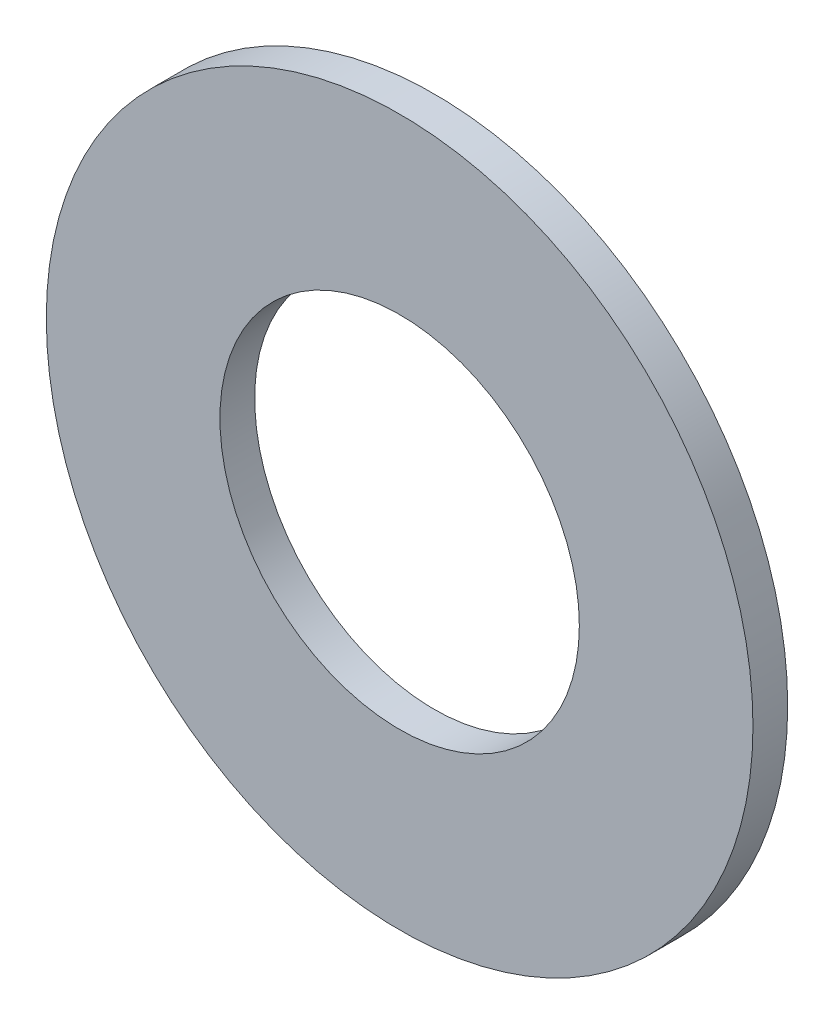
ISO-10303-21;
HEADER;
FILE_DESCRIPTION(('STEP AP214'),'2;1');
FILE_NAME('part.step','',(''),(''),'','','');
FILE_SCHEMA(('AUTOMOTIVE_DESIGN { 1 0 10303 214 1 1 1 1 }'));
ENDSEC;
DATA;
#1=APPLICATION_CONTEXT('core data for automotive mechanical design processes');
#2=APPLICATION_PROTOCOL_DEFINITION('international standard','automotive_design',2000,#1);
#3=PRODUCT_CONTEXT('',#1,'mechanical');
#4=PRODUCT('Part','Part','',(#3));
#5=PRODUCT_RELATED_PRODUCT_CATEGORY('part','',(#4));
#6=PRODUCT_DEFINITION_FORMATION('','',#4);
#7=PRODUCT_DEFINITION_CONTEXT('part definition',#1,'design');
#8=PRODUCT_DEFINITION('design','',#6,#7);
#9=PRODUCT_DEFINITION_SHAPE('','',#8);
#10=(LENGTH_UNIT() NAMED_UNIT(*) SI_UNIT(.MILLI.,.METRE.));
#11=(NAMED_UNIT(*) PLANE_ANGLE_UNIT() SI_UNIT($,.RADIAN.));
#12=(NAMED_UNIT(*) SI_UNIT($,.STERADIAN.) SOLID_ANGLE_UNIT());
#13=UNCERTAINTY_MEASURE_WITH_UNIT(LENGTH_MEASURE(1.E-05),#10,'distance_accuracy_value','');
#14=(GEOMETRIC_REPRESENTATION_CONTEXT(3) GLOBAL_UNCERTAINTY_ASSIGNED_CONTEXT((#13)) GLOBAL_UNIT_ASSIGNED_CONTEXT((#10,
#11,#12)) REPRESENTATION_CONTEXT('',''));
#15=CARTESIAN_POINT('',(0.,0.,0.));
#16=DIRECTION('',(0.,0.,1.));
#17=DIRECTION('',(1.,0.,0.));
#18=AXIS2_PLACEMENT_3D('',#15,#16,#17);
#19=CARTESIAN_POINT('',(0.,0.,2.54));
#20=DIRECTION('',(0.,0.,1.));
#21=DIRECTION('',(1.,0.,0.));
#22=AXIS2_PLACEMENT_3D('',#19,#20,#21);
#23=PLANE('',#22);
#24=CARTESIAN_POINT('',(0.,0.,2.54));
#25=DIRECTION('',(0.,0.,1.));
#26=DIRECTION('',(1.,0.,0.));
#27=AXIS2_PLACEMENT_3D('',#24,#25,#26);
#28=CIRCLE('',#27,25.8445);
#29=CARTESIAN_POINT('',(25.8445,0.,2.54));
#30=VERTEX_POINT('',#29);
#31=EDGE_CURVE('E10',#30,#30,#28,.T.);
#32=ORIENTED_EDGE('',*,*,#31,.T.);
#33=EDGE_LOOP('',(#32));
#34=FACE_BOUND('',#33,.T.);
#35=CARTESIAN_POINT('',(0.,0.,2.54));
#36=DIRECTION('',(0.,0.,1.));
#37=DIRECTION('',(1.,0.,0.));
#38=AXIS2_PLACEMENT_3D('',#35,#36,#37);
#39=CIRCLE('',#38,13.1445);
#40=CARTESIAN_POINT('',(13.1445,0.,2.54));
#41=VERTEX_POINT('',#40);
#42=EDGE_CURVE('E42',#41,#41,#39,.T.);
#43=ORIENTED_EDGE('',*,*,#42,.F.);
#44=EDGE_LOOP('',(#43));
#45=FACE_BOUND('',#44,.T.);
#46=ADVANCED_FACE('F31',(#34,#45),#23,.T.);
#47=CARTESIAN_POINT('',(0.,0.,0.));
#48=DIRECTION('',(0.,0.,1.));
#49=DIRECTION('',(1.,0.,0.));
#50=AXIS2_PLACEMENT_3D('',#47,#48,#49);
#51=PLANE('',#50);
#52=CARTESIAN_POINT('',(0.,0.,0.));
#53=DIRECTION('',(0.,0.,1.));
#54=DIRECTION('',(1.,0.,0.));
#55=AXIS2_PLACEMENT_3D('',#52,#53,#54);
#56=CIRCLE('',#55,25.8445);
#57=CARTESIAN_POINT('',(25.8445,0.,0.));
#58=VERTEX_POINT('',#57);
#59=EDGE_CURVE('E35',#58,#58,#56,.T.);
#60=ORIENTED_EDGE('',*,*,#59,.F.);
#61=EDGE_LOOP('',(#60));
#62=FACE_BOUND('',#61,.T.);
#63=CARTESIAN_POINT('',(0.,0.,0.));
#64=DIRECTION('',(0.,0.,1.));
#65=DIRECTION('',(1.,0.,0.));
#66=AXIS2_PLACEMENT_3D('',#63,#64,#65);
#67=CIRCLE('',#66,13.1445);
#68=CARTESIAN_POINT('',(13.1445,0.,0.));
#69=VERTEX_POINT('',#68);
#70=EDGE_CURVE('E44',#69,#69,#67,.T.);
#71=ORIENTED_EDGE('',*,*,#70,.T.);
#72=EDGE_LOOP('',(#71));
#73=FACE_BOUND('',#72,.T.);
#74=ADVANCED_FACE('F54',(#62,#73),#51,.F.);
#75=CARTESIAN_POINT('',(0.,0.,2.54));
#76=DIRECTION('',(0.,0.,-1.));
#77=DIRECTION('',(-1.,0.,0.));
#78=AXIS2_PLACEMENT_3D('',#75,#76,#77);
#79=CYLINDRICAL_SURFACE('',#78,25.8445);
#80=ORIENTED_EDGE('',*,*,#31,.F.);
#81=EDGE_LOOP('',(#80));
#82=FACE_BOUND('',#81,.T.);
#83=ORIENTED_EDGE('',*,*,#59,.T.);
#84=EDGE_LOOP('',(#83));
#85=FACE_BOUND('',#84,.T.);
#86=ADVANCED_FACE('F33',(#82,#85),#79,.T.);
#87=CARTESIAN_POINT('',(0.,0.,2.54));
#88=DIRECTION('',(0.,0.,-1.));
#89=DIRECTION('',(-1.,0.,0.));
#90=AXIS2_PLACEMENT_3D('',#87,#88,#89);
#91=CYLINDRICAL_SURFACE('',#90,13.1445);
#92=ORIENTED_EDGE('',*,*,#42,.T.);
#93=EDGE_LOOP('',(#92));
#94=FACE_BOUND('',#93,.T.);
#95=ORIENTED_EDGE('',*,*,#70,.F.);
#96=EDGE_LOOP('',(#95));
#97=FACE_BOUND('',#96,.T.);
#98=ADVANCED_FACE('F50',(#94,#97),#91,.F.);
#99=CLOSED_SHELL('',(#46,#74,#86,#98));
#100=MANIFOLD_SOLID_BREP('B2',#99);
#101=ADVANCED_BREP_SHAPE_REPRESENTATION('',(#18,#100),#14);
#102=SHAPE_DEFINITION_REPRESENTATION(#9,#101);
ENDSEC;
END-ISO-10303-21;
